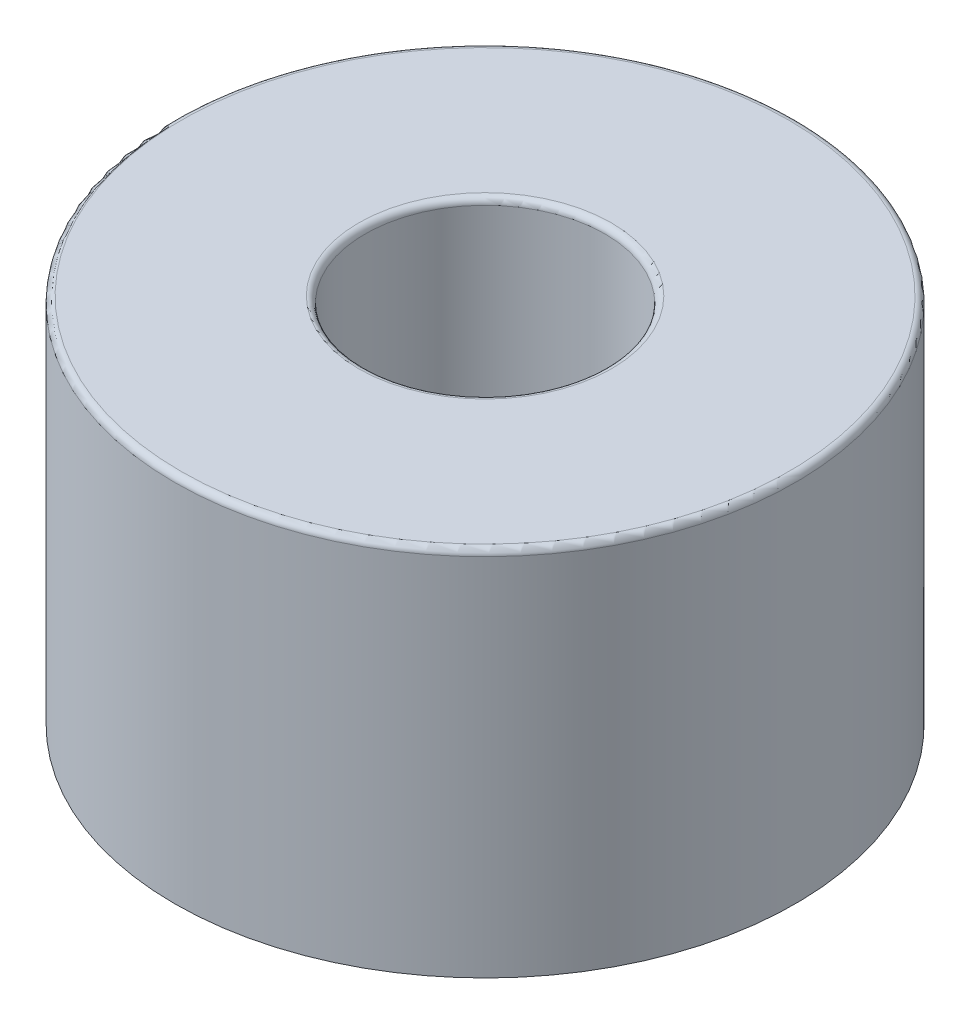
ISO-10303-21;
HEADER;
FILE_DESCRIPTION(('STEP AP214'),'2;1');
FILE_NAME('part.step','',(''),(''),'','','');
FILE_SCHEMA(('AUTOMOTIVE_DESIGN { 1 0 10303 214 1 1 1 1 }'));
ENDSEC;
DATA;
#1=APPLICATION_CONTEXT('core data for automotive mechanical design processes');
#2=APPLICATION_PROTOCOL_DEFINITION('international standard','automotive_design',2000,#1);
#3=PRODUCT_CONTEXT('',#1,'mechanical');
#4=PRODUCT('Part','Part','',(#3));
#5=PRODUCT_RELATED_PRODUCT_CATEGORY('part','',(#4));
#6=PRODUCT_DEFINITION_FORMATION('','',#4);
#7=PRODUCT_DEFINITION_CONTEXT('part definition',#1,'design');
#8=PRODUCT_DEFINITION('design','',#6,#7);
#9=PRODUCT_DEFINITION_SHAPE('','',#8);
#10=(LENGTH_UNIT() NAMED_UNIT(*) SI_UNIT(.MILLI.,.METRE.));
#11=(NAMED_UNIT(*) PLANE_ANGLE_UNIT() SI_UNIT($,.RADIAN.));
#12=(NAMED_UNIT(*) SI_UNIT($,.STERADIAN.) SOLID_ANGLE_UNIT());
#13=UNCERTAINTY_MEASURE_WITH_UNIT(LENGTH_MEASURE(1.E-05),#10,'distance_accuracy_value','');
#14=(GEOMETRIC_REPRESENTATION_CONTEXT(3) GLOBAL_UNCERTAINTY_ASSIGNED_CONTEXT((#13)) GLOBAL_UNIT_ASSIGNED_CONTEXT((#10,
#11,#12)) REPRESENTATION_CONTEXT('',''));
#15=CARTESIAN_POINT('',(0.,0.,0.));
#16=DIRECTION('',(0.,0.,1.));
#17=DIRECTION('',(1.,0.,0.));
#18=AXIS2_PLACEMENT_3D('',#15,#16,#17);
#19=CARTESIAN_POINT('',(0.,14.732,0.));
#20=DIRECTION('',(0.,1.,0.));
#21=DIRECTION('',(0.,0.,1.));
#22=AXIS2_PLACEMENT_3D('',#19,#20,#21);
#23=PLANE('',#22);
#24=CARTESIAN_POINT('',(0.,14.732,0.));
#25=DIRECTION('',(0.,1.,0.));
#26=DIRECTION('',(0.,0.,1.));
#27=AXIS2_PLACEMENT_3D('',#24,#25,#26);
#28=CIRCLE('',#27,5.0165);
#29=CARTESIAN_POINT('',(0.,14.732,5.0165));
#30=VERTEX_POINT('',#29);
#31=EDGE_CURVE('E40',#30,#30,#28,.F.);
#32=ORIENTED_EDGE('',*,*,#31,.T.);
#33=EDGE_LOOP('',(#32));
#34=FACE_BOUND('',#33,.T.);
#35=CARTESIAN_POINT('',(0.,14.732,0.));
#36=DIRECTION('',(0.,1.,0.));
#37=DIRECTION('',(0.,0.,1.));
#38=AXIS2_PLACEMENT_3D('',#35,#36,#37);
#39=CIRCLE('',#38,12.065);
#40=CARTESIAN_POINT('',(0.,14.732,12.065));
#41=VERTEX_POINT('',#40);
#42=EDGE_CURVE('E44',#41,#41,#39,.T.);
#43=ORIENTED_EDGE('',*,*,#42,.T.);
#44=EDGE_LOOP('',(#43));
#45=FACE_BOUND('',#44,.T.);
#46=ADVANCED_FACE('F33',(#34,#45),#23,.T.);
#47=CARTESIAN_POINT('',(0.,0.,0.));
#48=DIRECTION('',(0.,1.,0.));
#49=DIRECTION('',(0.,0.,1.));
#50=AXIS2_PLACEMENT_3D('',#47,#48,#49);
#51=PLANE('',#50);
#52=CARTESIAN_POINT('',(0.,0.,0.));
#53=DIRECTION('',(0.,1.,0.));
#54=DIRECTION('',(0.,0.,1.));
#55=AXIS2_PLACEMENT_3D('',#52,#53,#54);
#56=CIRCLE('',#55,12.319);
#57=CARTESIAN_POINT('',(0.,0.,12.319));
#58=VERTEX_POINT('',#57);
#59=EDGE_CURVE('E53',#58,#58,#56,.T.);
#60=ORIENTED_EDGE('',*,*,#59,.F.);
#61=EDGE_LOOP('',(#60));
#62=FACE_BOUND('',#61,.T.);
#63=CARTESIAN_POINT('',(0.,0.,0.));
#64=DIRECTION('',(0.,1.,0.));
#65=DIRECTION('',(0.,0.,1.));
#66=AXIS2_PLACEMENT_3D('',#63,#64,#65);
#67=CIRCLE('',#66,4.7625);
#68=CARTESIAN_POINT('',(0.,0.,4.7625));
#69=VERTEX_POINT('',#68);
#70=EDGE_CURVE('E56',#69,#69,#67,.T.);
#71=ORIENTED_EDGE('',*,*,#70,.T.);
#72=EDGE_LOOP('',(#71));
#73=FACE_BOUND('',#72,.T.);
#74=ADVANCED_FACE('F60',(#62,#73),#51,.F.);
#75=CARTESIAN_POINT('',(0.,14.732,0.));
#76=DIRECTION('',(0.,-1.,0.));
#77=DIRECTION('',(0.,0.,-1.));
#78=AXIS2_PLACEMENT_3D('',#75,#76,#77);
#79=CYLINDRICAL_SURFACE('',#78,12.319);
#80=CARTESIAN_POINT('',(0.,14.478,0.));
#81=DIRECTION('',(0.,1.,0.));
#82=DIRECTION('',(0.,0.,1.));
#83=AXIS2_PLACEMENT_3D('',#80,#81,#82);
#84=CIRCLE('',#83,12.319);
#85=CARTESIAN_POINT('',(0.,14.478,12.319));
#86=VERTEX_POINT('',#85);
#87=EDGE_CURVE('E10',#86,#86,#84,.F.);
#88=ORIENTED_EDGE('',*,*,#87,.T.);
#89=EDGE_LOOP('',(#88));
#90=FACE_BOUND('',#89,.T.);
#91=ORIENTED_EDGE('',*,*,#59,.T.);
#92=EDGE_LOOP('',(#91));
#93=FACE_BOUND('',#92,.T.);
#94=ADVANCED_FACE('F65',(#90,#93),#79,.T.);
#95=CARTESIAN_POINT('',(0.,14.732,0.));
#96=DIRECTION('',(0.,-1.,0.));
#97=DIRECTION('',(0.,0.,-1.));
#98=AXIS2_PLACEMENT_3D('',#95,#96,#97);
#99=CYLINDRICAL_SURFACE('',#98,4.7625);
#100=CARTESIAN_POINT('',(0.,14.478,0.));
#101=DIRECTION('',(0.,1.,0.));
#102=DIRECTION('',(0.,0.,1.));
#103=AXIS2_PLACEMENT_3D('',#100,#101,#102);
#104=CIRCLE('',#103,4.7625);
#105=CARTESIAN_POINT('',(0.,14.478,4.7625));
#106=VERTEX_POINT('',#105);
#107=EDGE_CURVE('E48',#106,#106,#104,.T.);
#108=ORIENTED_EDGE('',*,*,#107,.T.);
#109=EDGE_LOOP('',(#108));
#110=FACE_BOUND('',#109,.T.);
#111=ORIENTED_EDGE('',*,*,#70,.F.);
#112=EDGE_LOOP('',(#111));
#113=FACE_BOUND('',#112,.T.);
#114=ADVANCED_FACE('F62',(#110,#113),#99,.F.);
#115=CARTESIAN_POINT('',(0.,14.478,0.));
#116=DIRECTION('',(0.,1.,0.));
#117=DIRECTION('',(0.,0.,1.));
#118=AXIS2_PLACEMENT_3D('',#115,#116,#117);
#119=TOROIDAL_SURFACE('',#118,5.0165,0.254);
#120=ORIENTED_EDGE('',*,*,#31,.F.);
#121=EDGE_LOOP('',(#120));
#122=FACE_BOUND('',#121,.T.);
#123=ORIENTED_EDGE('',*,*,#107,.F.);
#124=EDGE_LOOP('',(#123));
#125=FACE_BOUND('',#124,.T.);
#126=ADVANCED_FACE('F64',(#122,#125),#119,.T.);
#127=CARTESIAN_POINT('',(0.,14.478,0.));
#128=DIRECTION('',(0.,1.,0.));
#129=DIRECTION('',(0.,0.,1.));
#130=AXIS2_PLACEMENT_3D('',#127,#128,#129);
#131=TOROIDAL_SURFACE('',#130,12.065,0.254);
#132=ORIENTED_EDGE('',*,*,#87,.F.);
#133=EDGE_LOOP('',(#132));
#134=FACE_BOUND('',#133,.T.);
#135=ORIENTED_EDGE('',*,*,#42,.F.);
#136=EDGE_LOOP('',(#135));
#137=FACE_BOUND('',#136,.T.);
#138=ADVANCED_FACE('F35',(#134,#137),#131,.T.);
#139=CLOSED_SHELL('',(#46,#74,#94,#114,#126,#138));
#140=MANIFOLD_SOLID_BREP('B2',#139);
#141=ADVANCED_BREP_SHAPE_REPRESENTATION('',(#18,#140),#14);
#142=SHAPE_DEFINITION_REPRESENTATION(#9,#141);
ENDSEC;
END-ISO-10303-21;
